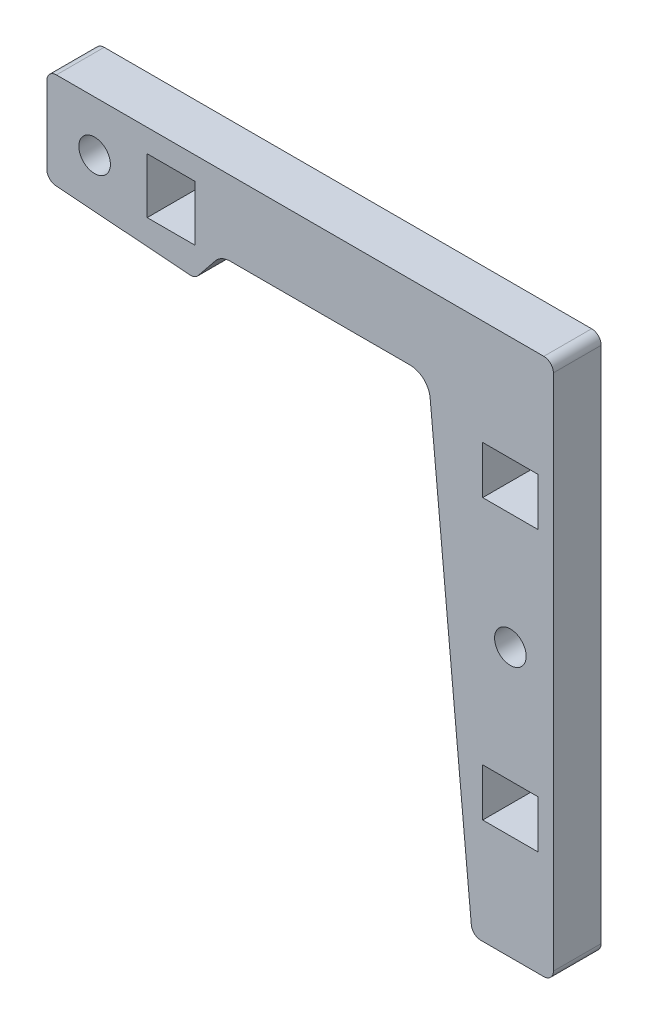
ISO-10303-21;
HEADER;
FILE_DESCRIPTION(('STEP AP214'),'2;1');
FILE_NAME('part.step','',(''),(''),'','','');
FILE_SCHEMA(('AUTOMOTIVE_DESIGN { 1 0 10303 214 1 1 1 1 }'));
ENDSEC;
DATA;
#1=APPLICATION_CONTEXT('core data for automotive mechanical design processes');
#2=APPLICATION_PROTOCOL_DEFINITION('international standard','automotive_design',2000,#1);
#3=PRODUCT_CONTEXT('',#1,'mechanical');
#4=PRODUCT('Part','Part','',(#3));
#5=PRODUCT_RELATED_PRODUCT_CATEGORY('part','',(#4));
#6=PRODUCT_DEFINITION_FORMATION('','',#4);
#7=PRODUCT_DEFINITION_CONTEXT('part definition',#1,'design');
#8=PRODUCT_DEFINITION('design','',#6,#7);
#9=PRODUCT_DEFINITION_SHAPE('','',#8);
#10=(LENGTH_UNIT() NAMED_UNIT(*) SI_UNIT(.MILLI.,.METRE.));
#11=(NAMED_UNIT(*) PLANE_ANGLE_UNIT() SI_UNIT($,.RADIAN.));
#12=(NAMED_UNIT(*) SI_UNIT($,.STERADIAN.) SOLID_ANGLE_UNIT());
#13=UNCERTAINTY_MEASURE_WITH_UNIT(LENGTH_MEASURE(1.E-05),#10,'distance_accuracy_value','');
#14=(GEOMETRIC_REPRESENTATION_CONTEXT(3) GLOBAL_UNCERTAINTY_ASSIGNED_CONTEXT((#13)) GLOBAL_UNIT_ASSIGNED_CONTEXT((#10,
#11,#12)) REPRESENTATION_CONTEXT('',''));
#15=CARTESIAN_POINT('',(0.,0.,0.));
#16=DIRECTION('',(0.,0.,1.));
#17=DIRECTION('',(1.,0.,0.));
#18=AXIS2_PLACEMENT_3D('',#15,#16,#17);
#19=CARTESIAN_POINT('',(394.462,25.6699999680005,79.314999993));
#20=DIRECTION('',(0.,0.,-1.));
#21=DIRECTION('',(-1.,0.,0.));
#22=AXIS2_PLACEMENT_3D('',#19,#20,#21);
#23=PLANE('',#22);
#24=DIRECTION('',(0.,1.,0.));
#25=VECTOR('',#24,1.);
#26=CARTESIAN_POINT('',(435.360750815999,24.13,79.314999993));
#27=LINE('',#26,#25);
#28=CARTESIAN_POINT('',(435.360750815999,17.78,79.314999993));
#29=VERTEX_POINT('',#28);
#30=CARTESIAN_POINT('',(435.360750815999,24.13,79.314999993));
#31=VERTEX_POINT('',#30);
#32=EDGE_CURVE('E264',#29,#31,#27,.T.);
#33=ORIENTED_EDGE('',*,*,#32,.F.);
#34=DIRECTION('',(1.,0.,0.));
#35=VECTOR('',#34,1.);
#36=CARTESIAN_POINT('',(428.010750783999,17.78,79.314999993));
#37=LINE('',#36,#35);
#38=CARTESIAN_POINT('',(428.010750783999,17.78,79.314999993));
#39=VERTEX_POINT('',#38);
#40=EDGE_CURVE('E272',#39,#29,#37,.T.);
#41=ORIENTED_EDGE('',*,*,#40,.F.);
#42=DIRECTION('',(0.,-1.,0.));
#43=VECTOR('',#42,1.);
#44=CARTESIAN_POINT('',(428.010750783999,24.13,79.314999993));
#45=LINE('',#44,#43);
#46=CARTESIAN_POINT('',(428.010750783999,24.13,79.314999993));
#47=VERTEX_POINT('',#46);
#48=EDGE_CURVE('E269',#47,#39,#45,.T.);
#49=ORIENTED_EDGE('',*,*,#48,.F.);
#50=DIRECTION('',(-1.,0.,0.));
#51=VECTOR('',#50,1.);
#52=CARTESIAN_POINT('',(428.010750783999,24.13,79.314999993));
#53=LINE('',#52,#51);
#54=EDGE_CURVE('E266',#31,#47,#53,.T.);
#55=ORIENTED_EDGE('',*,*,#54,.F.);
#56=EDGE_LOOP('',(#33,#41,#49,#55));
#57=FACE_BOUND('',#56,.T.);
#58=CARTESIAN_POINT('',(376.440750799999,31.3849999680003,79.314999993));
#59=DIRECTION('',(0.,0.,1.));
#60=DIRECTION('',(1.,0.,0.));
#61=AXIS2_PLACEMENT_3D('',#58,#59,#60);
#62=CIRCLE('',#61,2.09999999100001);
#63=CARTESIAN_POINT('',(378.540750791,31.3849999680003,79.314999993));
#64=VERTEX_POINT('',#63);
#65=EDGE_CURVE('E332',#64,#64,#62,.T.);
#66=ORIENTED_EDGE('',*,*,#65,.F.);
#67=EDGE_LOOP('',(#66));
#68=FACE_BOUND('',#67,.T.);
#69=DIRECTION('',(1.,0.,0.));
#70=VECTOR('',#69,1.);
#71=CARTESIAN_POINT('',(426.605750799999,-33.2899999679999,79.314999993));
#72=LINE('',#71,#70);
#73=CARTESIAN_POINT('',(427.7613488368,-33.2899999679999,79.314999993));
#74=VERTEX_POINT('',#73);
#75=CARTESIAN_POINT('',(436.130750799999,-33.2899999679999,79.314999993));
#76=VERTEX_POINT('',#75);
#77=EDGE_CURVE('E357',#74,#76,#72,.T.);
#78=ORIENTED_EDGE('',*,*,#77,.T.);
#79=CARTESIAN_POINT('',(436.130750799999,-32.0199999679999,79.314999993));
#80=DIRECTION('',(0.,0.,-1.));
#81=DIRECTION('',(-1.,0.,0.));
#82=AXIS2_PLACEMENT_3D('',#79,#80,#81);
#83=CIRCLE('',#82,1.27);
#84=CARTESIAN_POINT('',(437.400750799999,-32.0199999679999,79.314999993));
#85=VERTEX_POINT('',#84);
#86=EDGE_CURVE('E429',#76,#85,#83,.F.);
#87=ORIENTED_EDGE('',*,*,#86,.T.);
#88=DIRECTION('',(0.,1.,0.));
#89=VECTOR('',#88,1.);
#90=CARTESIAN_POINT('',(437.400750799999,-33.2899999679999,79.314999993));
#91=LINE('',#90,#89);
#92=CARTESIAN_POINT('',(437.400750799999,36.83,79.314999993));
#93=VERTEX_POINT('',#92);
#94=EDGE_CURVE('E360',#85,#93,#91,.T.);
#95=ORIENTED_EDGE('',*,*,#94,.T.);
#96=CARTESIAN_POINT('',(436.130750799999,36.83,79.314999993));
#97=DIRECTION('',(0.,0.,-1.));
#98=DIRECTION('',(-1.,0.,0.));
#99=AXIS2_PLACEMENT_3D('',#96,#97,#98);
#100=CIRCLE('',#99,1.27);
#101=CARTESIAN_POINT('',(436.130750799999,38.1,79.314999993));
#102=VERTEX_POINT('',#101);
#103=EDGE_CURVE('E427',#93,#102,#100,.F.);
#104=ORIENTED_EDGE('',*,*,#103,.T.);
#105=DIRECTION('',(-1.,0.,0.));
#106=VECTOR('',#105,1.);
#107=CARTESIAN_POINT('',(437.400750799999,38.1,79.314999993));
#108=LINE('',#107,#106);
#109=CARTESIAN_POINT('',(371.3607508,38.1,79.314999993));
#110=VERTEX_POINT('',#109);
#111=EDGE_CURVE('E338',#102,#110,#108,.T.);
#112=ORIENTED_EDGE('',*,*,#111,.T.);
#113=CARTESIAN_POINT('',(371.3607508,36.83,79.314999993));
#114=DIRECTION('',(0.,0.,-1.));
#115=DIRECTION('',(-1.,0.,0.));
#116=AXIS2_PLACEMENT_3D('',#113,#114,#115);
#117=CIRCLE('',#116,1.27);
#118=CARTESIAN_POINT('',(370.0907508,36.83,79.314999993));
#119=VERTEX_POINT('',#118);
#120=EDGE_CURVE('E425',#110,#119,#117,.F.);
#121=ORIENTED_EDGE('',*,*,#120,.T.);
#122=DIRECTION('',(0.,-1.,0.));
#123=VECTOR('',#122,1.);
#124=CARTESIAN_POINT('',(370.0907508,38.1,79.314999993));
#125=LINE('',#124,#123);
#126=CARTESIAN_POINT('',(370.0907508,26.5769075709626,79.314999993));
#127=VERTEX_POINT('',#126);
#128=EDGE_CURVE('E341',#119,#127,#125,.T.);
#129=ORIENTED_EDGE('',*,*,#128,.T.);
#130=CARTESIAN_POINT('',(371.3607508,26.5769075709626,79.314999993));
#131=DIRECTION('',(0.,0.,-1.));
#132=DIRECTION('',(-1.,0.,0.));
#133=AXIS2_PLACEMENT_3D('',#130,#131,#132);
#134=CIRCLE('',#133,1.27);
#135=CARTESIAN_POINT('',(371.264256343641,25.3105786958705,79.314999993));
#136=VERTEX_POINT('',#135);
#137=EDGE_CURVE('E421',#127,#136,#134,.F.);
#138=ORIENTED_EDGE('',*,*,#137,.T.);
#139=DIRECTION('',(0.997109350466224,-0.0759798868966356,0.));
#140=VECTOR('',#139,1.);
#141=CARTESIAN_POINT('',(370.0907508,25.4,79.314999993));
#142=LINE('',#141,#140);
#143=CARTESIAN_POINT('',(389.109268652957,23.9507859948022,79.314999993));
#144=VERTEX_POINT('',#143);
#145=EDGE_CURVE('E345',#136,#144,#142,.T.);
#146=ORIENTED_EDGE('',*,*,#145,.T.);
#147=CARTESIAN_POINT('',(389.205763109316,25.2171148698943,79.314999993));
#148=DIRECTION('',(0.,0.,-1.));
#149=DIRECTION('',(-1.,0.,0.));
#150=AXIS2_PLACEMENT_3D('',#147,#148,#149);
#151=CIRCLE('',#150,1.27);
#152=CARTESIAN_POINT('',(390.194953697403,24.4206213166004,79.314999993));
#153=VERTEX_POINT('',#152);
#154=EDGE_CURVE('E57',#144,#153,#151,.F.);
#155=ORIENTED_EDGE('',*,*,#154,.T.);
#156=DIRECTION('',(0.627160278184164,0.778890226840703,0.));
#157=VECTOR('',#156,1.);
#158=CARTESIAN_POINT('',(389.775750799999,23.8999999520003,79.314999993));
#159=LINE('',#158,#157);
#160=CARTESIAN_POINT('',(392.483618823825,27.2629870745882,79.314999993));
#161=VERTEX_POINT('',#160);
#162=EDGE_CURVE('E347',#153,#161,#159,.T.);
#163=ORIENTED_EDGE('',*,*,#162,.T.);
#164=CARTESIAN_POINT('',(394.462,25.6699999680005,79.314999993));
#165=DIRECTION('',(0.,0.,-1.));
#166=DIRECTION('',(-1.,0.,0.));
#167=AXIS2_PLACEMENT_3D('',#164,#165,#166);
#168=CIRCLE('',#167,2.54000000000002);
#169=CARTESIAN_POINT('',(394.462,28.2099999680005,79.314999993));
#170=VERTEX_POINT('',#169);
#171=EDGE_CURVE('E349',#161,#170,#168,.T.);
#172=ORIENTED_EDGE('',*,*,#171,.T.);
#173=DIRECTION('',(1.,0.,0.));
#174=VECTOR('',#173,1.);
#175=CARTESIAN_POINT('',(394.462,28.2099999680004,79.314999993));
#176=LINE('',#175,#174);
#177=CARTESIAN_POINT('',(418.338,28.2099999680005,79.314999993));
#178=VERTEX_POINT('',#177);
#179=EDGE_CURVE('E351',#170,#178,#176,.T.);
#180=ORIENTED_EDGE('',*,*,#179,.T.);
#181=CARTESIAN_POINT('',(418.338,25.5135074700115,79.314999993));
#182=DIRECTION('',(0.,0.,-1.));
#183=DIRECTION('',(1.,0.,0.));
#184=AXIS2_PLACEMENT_3D('',#181,#182,#183);
#185=CIRCLE('',#184,2.69649249798897);
#186=CARTESIAN_POINT('',(421.022522516097,25.7673000078818,79.314999993));
#187=VERTEX_POINT('',#186);
#188=EDGE_CURVE('E353',#178,#187,#185,.T.);
#189=ORIENTED_EDGE('',*,*,#188,.T.);
#190=DIRECTION('',(0.0941195045265449,-0.995560906658994,0.));
#191=VECTOR('',#190,1.);
#192=CARTESIAN_POINT('',(421.022522516097,25.7673000078818,79.314999993));
#193=LINE('',#192,#191);
#194=CARTESIAN_POINT('',(426.496986485343,-32.1395317387486,79.314999993));
#195=VERTEX_POINT('',#194);
#196=EDGE_CURVE('E355',#187,#195,#193,.T.);
#197=ORIENTED_EDGE('',*,*,#196,.T.);
#198=CARTESIAN_POINT('',(427.7613488368,-32.0199999679999,79.314999993));
#199=DIRECTION('',(0.,0.,-1.));
#200=DIRECTION('',(-1.,0.,0.));
#201=AXIS2_PLACEMENT_3D('',#198,#199,#200);
#202=CIRCLE('',#201,1.27);
#203=EDGE_CURVE('E423',#195,#74,#202,.F.);
#204=ORIENTED_EDGE('',*,*,#203,.T.);
#205=EDGE_LOOP('',(#78,#87,#95,#104,#112,#121,#129,#138,#146,#155,#163,#172,#180,#189,#197,#204));
#206=FACE_BOUND('',#205,.T.);
#207=DIRECTION('',(0.,1.,0.));
#208=VECTOR('',#207,1.);
#209=CARTESIAN_POINT('',(389.7757508,35.0599999840003,79.314999993));
#210=LINE('',#209,#208);
#211=CARTESIAN_POINT('',(389.775750799999,27.7099999520003,79.314999993));
#212=VERTEX_POINT('',#211);
#213=CARTESIAN_POINT('',(389.7757508,35.0599999840003,79.314999993));
#214=VERTEX_POINT('',#213);
#215=EDGE_CURVE('E301',#212,#214,#210,.T.);
#216=ORIENTED_EDGE('',*,*,#215,.F.);
#217=DIRECTION('',(1.,0.,0.));
#218=VECTOR('',#217,1.);
#219=CARTESIAN_POINT('',(383.425750799999,27.7099999520003,79.314999993));
#220=LINE('',#219,#218);
#221=CARTESIAN_POINT('',(383.425750799999,27.7099999520003,79.314999993));
#222=VERTEX_POINT('',#221);
#223=EDGE_CURVE('E309',#222,#212,#220,.T.);
#224=ORIENTED_EDGE('',*,*,#223,.F.);
#225=DIRECTION('',(0.,-1.,0.));
#226=VECTOR('',#225,1.);
#227=CARTESIAN_POINT('',(383.425750799999,35.0599999840003,79.314999993));
#228=LINE('',#227,#226);
#229=CARTESIAN_POINT('',(383.425750799999,35.0599999840003,79.314999993));
#230=VERTEX_POINT('',#229);
#231=EDGE_CURVE('E306',#230,#222,#228,.T.);
#232=ORIENTED_EDGE('',*,*,#231,.F.);
#233=DIRECTION('',(-1.,0.,0.));
#234=VECTOR('',#233,1.);
#235=CARTESIAN_POINT('',(383.425750799999,35.0599999840003,79.314999993));
#236=LINE('',#235,#234);
#237=EDGE_CURVE('E303',#214,#230,#236,.T.);
#238=ORIENTED_EDGE('',*,*,#237,.F.);
#239=EDGE_LOOP('',(#216,#224,#232,#238));
#240=FACE_BOUND('',#239,.T.);
#241=CARTESIAN_POINT('',(431.685750799999,2.40500001600008,79.314999993));
#242=DIRECTION('',(0.,0.,1.));
#243=DIRECTION('',(1.,0.,0.));
#244=AXIS2_PLACEMENT_3D('',#241,#242,#243);
#245=CIRCLE('',#244,2.09999999100001);
#246=CARTESIAN_POINT('',(433.785750790999,2.40500001600008,79.314999993));
#247=VERTEX_POINT('',#246);
#248=EDGE_CURVE('E295',#247,#247,#245,.T.);
#249=ORIENTED_EDGE('',*,*,#248,.F.);
#250=EDGE_LOOP('',(#249));
#251=FACE_BOUND('',#250,.T.);
#252=DIRECTION('',(0.,1.,0.));
#253=VECTOR('',#252,1.);
#254=CARTESIAN_POINT('',(435.360750815999,-12.9699999679999,79.314999993));
#255=LINE('',#254,#253);
#256=CARTESIAN_POINT('',(435.360750815999,-19.3199999679999,79.314999993));
#257=VERTEX_POINT('',#256);
#258=CARTESIAN_POINT('',(435.360750815999,-12.9699999679999,79.314999993));
#259=VERTEX_POINT('',#258);
#260=EDGE_CURVE('E223',#257,#259,#255,.T.);
#261=ORIENTED_EDGE('',*,*,#260,.F.);
#262=DIRECTION('',(1.,0.,0.));
#263=VECTOR('',#262,1.);
#264=CARTESIAN_POINT('',(428.010750783999,-19.3199999679999,79.314999993));
#265=LINE('',#264,#263);
#266=CARTESIAN_POINT('',(428.010750783999,-19.3199999679999,79.314999993));
#267=VERTEX_POINT('',#266);
#268=EDGE_CURVE('E248',#267,#257,#265,.T.);
#269=ORIENTED_EDGE('',*,*,#268,.F.);
#270=DIRECTION('',(0.,-1.,0.));
#271=VECTOR('',#270,1.);
#272=CARTESIAN_POINT('',(428.010750783999,-12.9699999679999,79.314999993));
#273=LINE('',#272,#271);
#274=CARTESIAN_POINT('',(428.010750783999,-12.9699999679999,79.314999993));
#275=VERTEX_POINT('',#274);
#276=EDGE_CURVE('E246',#275,#267,#273,.T.);
#277=ORIENTED_EDGE('',*,*,#276,.F.);
#278=DIRECTION('',(-1.,0.,0.));
#279=VECTOR('',#278,1.);
#280=CARTESIAN_POINT('',(428.010750783999,-12.9699999679999,79.314999993));
#281=LINE('',#280,#279);
#282=EDGE_CURVE('E233',#259,#275,#281,.T.);
#283=ORIENTED_EDGE('',*,*,#282,.F.);
#284=EDGE_LOOP('',(#261,#269,#277,#283));
#285=FACE_BOUND('',#284,.T.);
#286=ADVANCED_FACE('F34',(#57,#68,#206,#240,#251,#285),#23,.F.);
#287=CARTESIAN_POINT('',(394.462,25.6699999680005,72.964999993));
#288=DIRECTION('',(0.,0.,-1.));
#289=DIRECTION('',(-1.,0.,0.));
#290=AXIS2_PLACEMENT_3D('',#287,#288,#289);
#291=PLANE('',#290);
#292=DIRECTION('',(1.,0.,0.));
#293=VECTOR('',#292,1.);
#294=CARTESIAN_POINT('',(383.425750799999,27.7099999520003,72.964999993));
#295=LINE('',#294,#293);
#296=CARTESIAN_POINT('',(383.425750799999,27.7099999520003,72.964999993));
#297=VERTEX_POINT('',#296);
#298=CARTESIAN_POINT('',(389.775750799999,27.7099999520003,72.964999993));
#299=VERTEX_POINT('',#298);
#300=EDGE_CURVE('E304',#297,#299,#295,.T.);
#301=ORIENTED_EDGE('',*,*,#300,.T.);
#302=DIRECTION('',(0.,1.,0.));
#303=VECTOR('',#302,1.);
#304=CARTESIAN_POINT('',(389.7757508,35.0599999840003,72.964999993));
#305=LINE('',#304,#303);
#306=CARTESIAN_POINT('',(389.7757508,35.0599999840003,72.964999993));
#307=VERTEX_POINT('',#306);
#308=EDGE_CURVE('E298',#299,#307,#305,.T.);
#309=ORIENTED_EDGE('',*,*,#308,.T.);
#310=DIRECTION('',(-1.,0.,0.));
#311=VECTOR('',#310,1.);
#312=CARTESIAN_POINT('',(383.425750799999,35.0599999840003,72.964999993));
#313=LINE('',#312,#311);
#314=CARTESIAN_POINT('',(383.425750799999,35.0599999840003,72.964999993));
#315=VERTEX_POINT('',#314);
#316=EDGE_CURVE('E314',#307,#315,#313,.T.);
#317=ORIENTED_EDGE('',*,*,#316,.T.);
#318=DIRECTION('',(0.,-1.,0.));
#319=VECTOR('',#318,1.);
#320=CARTESIAN_POINT('',(383.425750799999,35.0599999840003,72.964999993));
#321=LINE('',#320,#319);
#322=EDGE_CURVE('E317',#315,#297,#321,.T.);
#323=ORIENTED_EDGE('',*,*,#322,.T.);
#324=EDGE_LOOP('',(#301,#309,#317,#323));
#325=FACE_BOUND('',#324,.T.);
#326=CARTESIAN_POINT('',(376.440750799999,31.3849999680003,72.964999993));
#327=DIRECTION('',(0.,0.,1.));
#328=DIRECTION('',(1.,0.,0.));
#329=AXIS2_PLACEMENT_3D('',#326,#327,#328);
#330=CIRCLE('',#329,2.09999999100001);
#331=CARTESIAN_POINT('',(378.540750791,31.3849999680003,72.964999993));
#332=VERTEX_POINT('',#331);
#333=EDGE_CURVE('E331',#332,#332,#330,.T.);
#334=ORIENTED_EDGE('',*,*,#333,.T.);
#335=EDGE_LOOP('',(#334));
#336=FACE_BOUND('',#335,.T.);
#337=DIRECTION('',(0.,1.,0.));
#338=VECTOR('',#337,1.);
#339=CARTESIAN_POINT('',(437.400750799999,-33.2899999679999,72.964999993));
#340=LINE('',#339,#338);
#341=CARTESIAN_POINT('',(437.400750799999,-32.0199999679999,72.964999993));
#342=VERTEX_POINT('',#341);
#343=CARTESIAN_POINT('',(437.400750799999,36.83,72.964999993));
#344=VERTEX_POINT('',#343);
#345=EDGE_CURVE('E342',#342,#344,#340,.T.);
#346=ORIENTED_EDGE('',*,*,#345,.F.);
#347=CARTESIAN_POINT('',(436.130750799999,-32.0199999679999,72.964999993));
#348=DIRECTION('',(0.,0.,-1.));
#349=DIRECTION('',(-1.,0.,0.));
#350=AXIS2_PLACEMENT_3D('',#347,#348,#349);
#351=CIRCLE('',#350,1.27);
#352=CARTESIAN_POINT('',(436.130750799999,-33.2899999679999,72.964999993));
#353=VERTEX_POINT('',#352);
#354=EDGE_CURVE('E413',#342,#353,#351,.T.);
#355=ORIENTED_EDGE('',*,*,#354,.T.);
#356=DIRECTION('',(1.,0.,0.));
#357=VECTOR('',#356,1.);
#358=CARTESIAN_POINT('',(426.605750799999,-33.2899999679999,72.964999993));
#359=LINE('',#358,#357);
#360=CARTESIAN_POINT('',(427.7613488368,-33.2899999679999,72.964999993));
#361=VERTEX_POINT('',#360);
#362=EDGE_CURVE('E382',#361,#353,#359,.T.);
#363=ORIENTED_EDGE('',*,*,#362,.F.);
#364=CARTESIAN_POINT('',(427.7613488368,-32.0199999679999,72.964999993));
#365=DIRECTION('',(0.,0.,-1.));
#366=DIRECTION('',(-1.,0.,0.));
#367=AXIS2_PLACEMENT_3D('',#364,#365,#366);
#368=CIRCLE('',#367,1.27);
#369=CARTESIAN_POINT('',(426.496986485343,-32.1395317387486,72.964999993));
#370=VERTEX_POINT('',#369);
#371=EDGE_CURVE('E407',#361,#370,#368,.T.);
#372=ORIENTED_EDGE('',*,*,#371,.T.);
#373=DIRECTION('',(0.0941195045265449,-0.995560906658994,0.));
#374=VECTOR('',#373,1.);
#375=CARTESIAN_POINT('',(421.022522516097,25.7673000078818,72.964999993));
#376=LINE('',#375,#374);
#377=CARTESIAN_POINT('',(421.022522516097,25.7673000078818,72.964999993));
#378=VERTEX_POINT('',#377);
#379=EDGE_CURVE('E380',#378,#370,#376,.T.);
#380=ORIENTED_EDGE('',*,*,#379,.F.);
#381=CARTESIAN_POINT('',(418.338,25.5135074700115,72.964999993));
#382=DIRECTION('',(0.,0.,-1.));
#383=DIRECTION('',(1.,0.,0.));
#384=AXIS2_PLACEMENT_3D('',#381,#382,#383);
#385=CIRCLE('',#384,2.69649249798897);
#386=CARTESIAN_POINT('',(418.338,28.2099999680005,72.964999993));
#387=VERTEX_POINT('',#386);
#388=EDGE_CURVE('E378',#387,#378,#385,.T.);
#389=ORIENTED_EDGE('',*,*,#388,.F.);
#390=DIRECTION('',(1.,0.,0.));
#391=VECTOR('',#390,1.);
#392=CARTESIAN_POINT('',(394.462,28.2099999680004,72.964999993));
#393=LINE('',#392,#391);
#394=CARTESIAN_POINT('',(394.462,28.2099999680005,72.964999993));
#395=VERTEX_POINT('',#394);
#396=EDGE_CURVE('E376',#395,#387,#393,.T.);
#397=ORIENTED_EDGE('',*,*,#396,.F.);
#398=CARTESIAN_POINT('',(394.462,25.6699999680005,72.964999993));
#399=DIRECTION('',(0.,0.,-1.));
#400=DIRECTION('',(-1.,0.,0.));
#401=AXIS2_PLACEMENT_3D('',#398,#399,#400);
#402=CIRCLE('',#401,2.54000000000002);
#403=CARTESIAN_POINT('',(392.483618823825,27.2629870745882,72.964999993));
#404=VERTEX_POINT('',#403);
#405=EDGE_CURVE('E374',#404,#395,#402,.T.);
#406=ORIENTED_EDGE('',*,*,#405,.F.);
#407=DIRECTION('',(0.627160278184164,0.778890226840703,0.));
#408=VECTOR('',#407,1.);
#409=CARTESIAN_POINT('',(389.775750799999,23.8999999520003,72.964999993));
#410=LINE('',#409,#408);
#411=CARTESIAN_POINT('',(390.194953697403,24.4206213166004,72.964999993));
#412=VERTEX_POINT('',#411);
#413=EDGE_CURVE('E372',#412,#404,#410,.T.);
#414=ORIENTED_EDGE('',*,*,#413,.F.);
#415=CARTESIAN_POINT('',(389.205763109316,25.2171148698943,72.964999993));
#416=DIRECTION('',(0.,0.,-1.));
#417=DIRECTION('',(-1.,0.,0.));
#418=AXIS2_PLACEMENT_3D('',#415,#416,#417);
#419=CIRCLE('',#418,1.27);
#420=CARTESIAN_POINT('',(389.109268652957,23.9507859948022,72.964999993));
#421=VERTEX_POINT('',#420);
#422=EDGE_CURVE('E403',#412,#421,#419,.T.);
#423=ORIENTED_EDGE('',*,*,#422,.T.);
#424=DIRECTION('',(0.997109350466224,-0.0759798868966356,0.));
#425=VECTOR('',#424,1.);
#426=CARTESIAN_POINT('',(370.0907508,25.4,72.964999993));
#427=LINE('',#426,#425);
#428=CARTESIAN_POINT('',(371.264256343641,25.3105786958705,72.964999993));
#429=VERTEX_POINT('',#428);
#430=EDGE_CURVE('E369',#429,#421,#427,.T.);
#431=ORIENTED_EDGE('',*,*,#430,.F.);
#432=CARTESIAN_POINT('',(371.3607508,26.5769075709626,72.964999993));
#433=DIRECTION('',(0.,0.,-1.));
#434=DIRECTION('',(-1.,0.,0.));
#435=AXIS2_PLACEMENT_3D('',#432,#433,#434);
#436=CIRCLE('',#435,1.27);
#437=CARTESIAN_POINT('',(370.0907508,26.5769075709626,72.964999993));
#438=VERTEX_POINT('',#437);
#439=EDGE_CURVE('E405',#429,#438,#436,.T.);
#440=ORIENTED_EDGE('',*,*,#439,.T.);
#441=DIRECTION('',(0.,-1.,0.));
#442=VECTOR('',#441,1.);
#443=CARTESIAN_POINT('',(370.0907508,38.1,72.964999993));
#444=LINE('',#443,#442);
#445=CARTESIAN_POINT('',(370.0907508,36.83,72.964999993));
#446=VERTEX_POINT('',#445);
#447=EDGE_CURVE('E366',#446,#438,#444,.T.);
#448=ORIENTED_EDGE('',*,*,#447,.F.);
#449=CARTESIAN_POINT('',(371.3607508,36.83,72.964999993));
#450=DIRECTION('',(0.,0.,-1.));
#451=DIRECTION('',(-1.,0.,0.));
#452=AXIS2_PLACEMENT_3D('',#449,#450,#451);
#453=CIRCLE('',#452,1.27);
#454=CARTESIAN_POINT('',(371.3607508,38.1,72.964999993));
#455=VERTEX_POINT('',#454);
#456=EDGE_CURVE('E409',#446,#455,#453,.T.);
#457=ORIENTED_EDGE('',*,*,#456,.T.);
#458=DIRECTION('',(-1.,0.,0.));
#459=VECTOR('',#458,1.);
#460=CARTESIAN_POINT('',(437.400750799999,38.1,72.964999993));
#461=LINE('',#460,#459);
#462=CARTESIAN_POINT('',(436.130750799999,38.1,72.964999993));
#463=VERTEX_POINT('',#462);
#464=EDGE_CURVE('E335',#463,#455,#461,.T.);
#465=ORIENTED_EDGE('',*,*,#464,.F.);
#466=CARTESIAN_POINT('',(436.130750799999,36.83,72.964999993));
#467=DIRECTION('',(0.,0.,-1.));
#468=DIRECTION('',(-1.,0.,0.));
#469=AXIS2_PLACEMENT_3D('',#466,#467,#468);
#470=CIRCLE('',#469,1.27);
#471=EDGE_CURVE('E411',#463,#344,#470,.T.);
#472=ORIENTED_EDGE('',*,*,#471,.T.);
#473=EDGE_LOOP('',(#346,#355,#363,#372,#380,#389,#397,#406,#414,#423,#431,#440,#448,#457,#465,#472));
#474=FACE_BOUND('',#473,.T.);
#475=CARTESIAN_POINT('',(431.685750799999,2.40500001600008,72.964999993));
#476=DIRECTION('',(0.,0.,1.));
#477=DIRECTION('',(1.,0.,0.));
#478=AXIS2_PLACEMENT_3D('',#475,#476,#477);
#479=CIRCLE('',#478,2.09999999100001);
#480=CARTESIAN_POINT('',(433.785750790999,2.40500001600008,72.964999993));
#481=VERTEX_POINT('',#480);
#482=EDGE_CURVE('E294',#481,#481,#479,.T.);
#483=ORIENTED_EDGE('',*,*,#482,.T.);
#484=EDGE_LOOP('',(#483));
#485=FACE_BOUND('',#484,.T.);
#486=DIRECTION('',(1.,0.,0.));
#487=VECTOR('',#486,1.);
#488=CARTESIAN_POINT('',(428.010750783999,17.78,72.964999993));
#489=LINE('',#488,#487);
#490=CARTESIAN_POINT('',(428.010750783999,17.78,72.964999993));
#491=VERTEX_POINT('',#490);
#492=CARTESIAN_POINT('',(435.360750815999,17.78,72.964999993));
#493=VERTEX_POINT('',#492);
#494=EDGE_CURVE('E267',#491,#493,#489,.T.);
#495=ORIENTED_EDGE('',*,*,#494,.T.);
#496=DIRECTION('',(0.,1.,0.));
#497=VECTOR('',#496,1.);
#498=CARTESIAN_POINT('',(435.360750815999,24.13,72.964999993));
#499=LINE('',#498,#497);
#500=CARTESIAN_POINT('',(435.360750815999,24.13,72.964999993));
#501=VERTEX_POINT('',#500);
#502=EDGE_CURVE('E241',#493,#501,#499,.T.);
#503=ORIENTED_EDGE('',*,*,#502,.T.);
#504=DIRECTION('',(-1.,0.,0.));
#505=VECTOR('',#504,1.);
#506=CARTESIAN_POINT('',(428.010750783999,24.13,72.964999993));
#507=LINE('',#506,#505);
#508=CARTESIAN_POINT('',(428.010750783999,24.13,72.964999993));
#509=VERTEX_POINT('',#508);
#510=EDGE_CURVE('E277',#501,#509,#507,.T.);
#511=ORIENTED_EDGE('',*,*,#510,.T.);
#512=DIRECTION('',(0.,-1.,0.));
#513=VECTOR('',#512,1.);
#514=CARTESIAN_POINT('',(428.010750783999,24.13,72.964999993));
#515=LINE('',#514,#513);
#516=EDGE_CURVE('E280',#509,#491,#515,.T.);
#517=ORIENTED_EDGE('',*,*,#516,.T.);
#518=EDGE_LOOP('',(#495,#503,#511,#517));
#519=FACE_BOUND('',#518,.T.);
#520=DIRECTION('',(1.,0.,0.));
#521=VECTOR('',#520,1.);
#522=CARTESIAN_POINT('',(428.010750783999,-19.3199999679999,72.964999993));
#523=LINE('',#522,#521);
#524=CARTESIAN_POINT('',(428.010750783999,-19.3199999679999,72.964999993));
#525=VERTEX_POINT('',#524);
#526=CARTESIAN_POINT('',(435.360750815999,-19.3199999679999,72.964999993));
#527=VERTEX_POINT('',#526);
#528=EDGE_CURVE('E234',#525,#527,#523,.T.);
#529=ORIENTED_EDGE('',*,*,#528,.T.);
#530=DIRECTION('',(0.,1.,0.));
#531=VECTOR('',#530,1.);
#532=CARTESIAN_POINT('',(435.360750815999,-12.9699999679999,72.964999993));
#533=LINE('',#532,#531);
#534=CARTESIAN_POINT('',(435.360750815999,-12.9699999679999,72.964999993));
#535=VERTEX_POINT('',#534);
#536=EDGE_CURVE('E252',#527,#535,#533,.T.);
#537=ORIENTED_EDGE('',*,*,#536,.T.);
#538=DIRECTION('',(-1.,0.,0.));
#539=VECTOR('',#538,1.);
#540=CARTESIAN_POINT('',(428.010750783999,-12.9699999679999,72.964999993));
#541=LINE('',#540,#539);
#542=CARTESIAN_POINT('',(428.010750783999,-12.9699999679999,72.964999993));
#543=VERTEX_POINT('',#542);
#544=EDGE_CURVE('E240',#535,#543,#541,.T.);
#545=ORIENTED_EDGE('',*,*,#544,.T.);
#546=DIRECTION('',(0.,-1.,0.));
#547=VECTOR('',#546,1.);
#548=CARTESIAN_POINT('',(428.010750783999,-12.9699999679999,72.964999993));
#549=LINE('',#548,#547);
#550=EDGE_CURVE('E255',#543,#525,#549,.T.);
#551=ORIENTED_EDGE('',*,*,#550,.T.);
#552=EDGE_LOOP('',(#529,#537,#545,#551));
#553=FACE_BOUND('',#552,.T.);
#554=ADVANCED_FACE('F454',(#325,#336,#474,#485,#519,#553),#291,.T.);
#555=CARTESIAN_POINT('',(437.400750799999,38.1,79.314999993));
#556=DIRECTION('',(0.,-1.,0.));
#557=DIRECTION('',(0.,0.,-1.));
#558=AXIS2_PLACEMENT_3D('',#555,#556,#557);
#559=PLANE('',#558);
#560=ORIENTED_EDGE('',*,*,#111,.F.);
#561=DIRECTION('',(0.,0.,-1.));
#562=VECTOR('',#561,1.);
#563=CARTESIAN_POINT('',(436.130750799999,38.1,79.314999993));
#564=LINE('',#563,#562);
#565=EDGE_CURVE('E433',#102,#463,#564,.T.);
#566=ORIENTED_EDGE('',*,*,#565,.T.);
#567=ORIENTED_EDGE('',*,*,#464,.T.);
#568=DIRECTION('',(0.,0.,-1.));
#569=VECTOR('',#568,1.);
#570=CARTESIAN_POINT('',(371.3607508,38.1,79.314999993));
#571=LINE('',#570,#569);
#572=EDGE_CURVE('E431',#455,#110,#571,.F.);
#573=ORIENTED_EDGE('',*,*,#572,.T.);
#574=EDGE_LOOP('',(#560,#566,#567,#573));
#575=FACE_BOUND('',#574,.T.);
#576=ADVANCED_FACE('F504',(#575),#559,.F.);
#577=CARTESIAN_POINT('',(370.0907508,38.1,79.314999993));
#578=DIRECTION('',(1.,0.,0.));
#579=DIRECTION('',(0.,0.,-1.));
#580=AXIS2_PLACEMENT_3D('',#577,#578,#579);
#581=PLANE('',#580);
#582=ORIENTED_EDGE('',*,*,#128,.F.);
#583=DIRECTION('',(0.,0.,-1.));
#584=VECTOR('',#583,1.);
#585=CARTESIAN_POINT('',(370.0907508,36.83,79.314999993));
#586=LINE('',#585,#584);
#587=EDGE_CURVE('E438',#119,#446,#586,.T.);
#588=ORIENTED_EDGE('',*,*,#587,.T.);
#589=ORIENTED_EDGE('',*,*,#447,.T.);
#590=DIRECTION('',(0.,0.,-1.));
#591=VECTOR('',#590,1.);
#592=CARTESIAN_POINT('',(370.0907508,26.5769075709626,79.314999993));
#593=LINE('',#592,#591);
#594=EDGE_CURVE('E436',#438,#127,#593,.F.);
#595=ORIENTED_EDGE('',*,*,#594,.T.);
#596=EDGE_LOOP('',(#582,#588,#589,#595));
#597=FACE_BOUND('',#596,.T.);
#598=ADVANCED_FACE('F512',(#597),#581,.F.);
#599=CARTESIAN_POINT('',(370.0907508,25.4,79.314999993));
#600=DIRECTION('',(0.0759798868966356,0.997109350466224,0.));
#601=DIRECTION('',(-0.997109350466224,0.0759798868966356,0.));
#602=AXIS2_PLACEMENT_3D('',#599,#600,#601);
#603=PLANE('',#602);
#604=ORIENTED_EDGE('',*,*,#145,.F.);
#605=DIRECTION('',(0.,0.,-1.));
#606=VECTOR('',#605,1.);
#607=CARTESIAN_POINT('',(371.264256343641,25.3105786958705,79.314999993));
#608=LINE('',#607,#606);
#609=EDGE_CURVE('E42',#136,#429,#608,.T.);
#610=ORIENTED_EDGE('',*,*,#609,.T.);
#611=ORIENTED_EDGE('',*,*,#430,.T.);
#612=DIRECTION('',(0.,0.,-1.));
#613=VECTOR('',#612,1.);
#614=CARTESIAN_POINT('',(389.109268652957,23.9507859948022,79.314999993));
#615=LINE('',#614,#613);
#616=EDGE_CURVE('E442',#421,#144,#615,.F.);
#617=ORIENTED_EDGE('',*,*,#616,.T.);
#618=EDGE_LOOP('',(#604,#610,#611,#617));
#619=FACE_BOUND('',#618,.T.);
#620=ADVANCED_FACE('F448',(#619),#603,.F.);
#621=CARTESIAN_POINT('',(389.775750799999,23.8999999520003,79.314999993));
#622=DIRECTION('',(-0.778890226840703,0.627160278184164,0.));
#623=DIRECTION('',(-0.627160278184164,-0.778890226840704,0.));
#624=AXIS2_PLACEMENT_3D('',#621,#622,#623);
#625=PLANE('',#624);
#626=ORIENTED_EDGE('',*,*,#162,.F.);
#627=DIRECTION('',(0.,0.,-1.));
#628=VECTOR('',#627,1.);
#629=CARTESIAN_POINT('',(390.194953697403,24.4206213166004,79.314999993));
#630=LINE('',#629,#628);
#631=EDGE_CURVE('E11',#153,#412,#630,.T.);
#632=ORIENTED_EDGE('',*,*,#631,.T.);
#633=ORIENTED_EDGE('',*,*,#413,.T.);
#634=DIRECTION('',(0.,0.,-1.));
#635=VECTOR('',#634,1.);
#636=CARTESIAN_POINT('',(392.483618823825,27.2629870745882,79.314999993));
#637=LINE('',#636,#635);
#638=EDGE_CURVE('E395',#161,#404,#637,.T.);
#639=ORIENTED_EDGE('',*,*,#638,.F.);
#640=EDGE_LOOP('',(#626,#632,#633,#639));
#641=FACE_BOUND('',#640,.T.);
#642=ADVANCED_FACE('F462',(#641),#625,.F.);
#643=CARTESIAN_POINT('',(394.462,25.6699999680005,79.314999993));
#644=DIRECTION('',(0.,0.,-1.));
#645=DIRECTION('',(-1.,0.,0.));
#646=AXIS2_PLACEMENT_3D('',#643,#644,#645);
#647=CYLINDRICAL_SURFACE('',#646,2.54000000000002);
#648=ORIENTED_EDGE('',*,*,#405,.T.);
#649=DIRECTION('',(0.,0.,-1.));
#650=VECTOR('',#649,1.);
#651=CARTESIAN_POINT('',(394.462,28.2099999680005,79.314999993));
#652=LINE('',#651,#650);
#653=EDGE_CURVE('E392',#170,#395,#652,.T.);
#654=ORIENTED_EDGE('',*,*,#653,.F.);
#655=ORIENTED_EDGE('',*,*,#171,.F.);
#656=ORIENTED_EDGE('',*,*,#638,.T.);
#657=EDGE_LOOP('',(#648,#654,#655,#656));
#658=FACE_BOUND('',#657,.T.);
#659=ADVANCED_FACE('F470',(#658),#647,.F.);
#660=CARTESIAN_POINT('',(394.462,28.2099999680004,79.314999993));
#661=DIRECTION('',(0.,1.,0.));
#662=DIRECTION('',(-1.,0.,0.));
#663=AXIS2_PLACEMENT_3D('',#660,#661,#662);
#664=PLANE('',#663);
#665=ORIENTED_EDGE('',*,*,#396,.T.);
#666=DIRECTION('',(0.,0.,-1.));
#667=VECTOR('',#666,1.);
#668=CARTESIAN_POINT('',(418.338,28.2099999680005,79.314999993));
#669=LINE('',#668,#667);
#670=EDGE_CURVE('E389',#178,#387,#669,.T.);
#671=ORIENTED_EDGE('',*,*,#670,.F.);
#672=ORIENTED_EDGE('',*,*,#179,.F.);
#673=ORIENTED_EDGE('',*,*,#653,.T.);
#674=EDGE_LOOP('',(#665,#671,#672,#673));
#675=FACE_BOUND('',#674,.T.);
#676=ADVANCED_FACE('F473',(#675),#664,.F.);
#677=CARTESIAN_POINT('',(418.338,25.5135074700115,79.314999993));
#678=DIRECTION('',(0.,0.,-1.));
#679=DIRECTION('',(-1.,0.,0.));
#680=AXIS2_PLACEMENT_3D('',#677,#678,#679);
#681=CYLINDRICAL_SURFACE('',#680,2.69649249798897);
#682=ORIENTED_EDGE('',*,*,#388,.T.);
#683=DIRECTION('',(0.,0.,-1.));
#684=VECTOR('',#683,1.);
#685=CARTESIAN_POINT('',(421.022522516097,25.7673000078818,79.314999993));
#686=LINE('',#685,#684);
#687=EDGE_CURVE('E363',#187,#378,#686,.T.);
#688=ORIENTED_EDGE('',*,*,#687,.F.);
#689=ORIENTED_EDGE('',*,*,#188,.F.);
#690=ORIENTED_EDGE('',*,*,#670,.T.);
#691=EDGE_LOOP('',(#682,#688,#689,#690));
#692=FACE_BOUND('',#691,.T.);
#693=ADVANCED_FACE('F478',(#692),#681,.F.);
#694=CARTESIAN_POINT('',(421.022522516097,25.7673000078818,79.314999993));
#695=DIRECTION('',(0.995560906658994,0.0941195045265449,0.));
#696=DIRECTION('',(-0.0941195045265449,0.995560906658994,0.));
#697=AXIS2_PLACEMENT_3D('',#694,#695,#696);
#698=PLANE('',#697);
#699=ORIENTED_EDGE('',*,*,#379,.T.);
#700=DIRECTION('',(0.,0.,-1.));
#701=VECTOR('',#700,1.);
#702=CARTESIAN_POINT('',(426.496986485343,-32.1395317387486,79.314999993));
#703=LINE('',#702,#701);
#704=EDGE_CURVE('E49',#370,#195,#703,.F.);
#705=ORIENTED_EDGE('',*,*,#704,.T.);
#706=ORIENTED_EDGE('',*,*,#196,.F.);
#707=ORIENTED_EDGE('',*,*,#687,.T.);
#708=EDGE_LOOP('',(#699,#705,#706,#707));
#709=FACE_BOUND('',#708,.T.);
#710=ADVANCED_FACE('F539',(#709),#698,.F.);
#711=CARTESIAN_POINT('',(426.605750799999,-33.2899999679999,79.314999993));
#712=DIRECTION('',(0.,1.,0.));
#713=DIRECTION('',(0.,0.,1.));
#714=AXIS2_PLACEMENT_3D('',#711,#712,#713);
#715=PLANE('',#714);
#716=ORIENTED_EDGE('',*,*,#362,.T.);
#717=DIRECTION('',(0.,0.,-1.));
#718=VECTOR('',#717,1.);
#719=CARTESIAN_POINT('',(436.130750799999,-33.2899999679999,79.314999993));
#720=LINE('',#719,#718);
#721=EDGE_CURVE('E418',#353,#76,#720,.F.);
#722=ORIENTED_EDGE('',*,*,#721,.T.);
#723=ORIENTED_EDGE('',*,*,#77,.F.);
#724=DIRECTION('',(0.,0.,-1.));
#725=VECTOR('',#724,1.);
#726=CARTESIAN_POINT('',(427.7613488368,-33.2899999679999,79.314999993));
#727=LINE('',#726,#725);
#728=EDGE_CURVE('E415',#74,#361,#727,.T.);
#729=ORIENTED_EDGE('',*,*,#728,.T.);
#730=EDGE_LOOP('',(#716,#722,#723,#729));
#731=FACE_BOUND('',#730,.T.);
#732=ADVANCED_FACE('F486',(#731),#715,.F.);
#733=CARTESIAN_POINT('',(437.400750799999,-33.2899999679999,79.314999993));
#734=DIRECTION('',(-1.,0.,0.));
#735=DIRECTION('',(0.,0.,1.));
#736=AXIS2_PLACEMENT_3D('',#733,#734,#735);
#737=PLANE('',#736);
#738=ORIENTED_EDGE('',*,*,#94,.F.);
#739=DIRECTION('',(0.,0.,-1.));
#740=VECTOR('',#739,1.);
#741=CARTESIAN_POINT('',(437.400750799999,-32.0199999679999,79.314999993));
#742=LINE('',#741,#740);
#743=EDGE_CURVE('E400',#85,#342,#742,.T.);
#744=ORIENTED_EDGE('',*,*,#743,.T.);
#745=ORIENTED_EDGE('',*,*,#345,.T.);
#746=DIRECTION('',(0.,0.,-1.));
#747=VECTOR('',#746,1.);
#748=CARTESIAN_POINT('',(437.400750799999,36.83,79.314999993));
#749=LINE('',#748,#747);
#750=EDGE_CURVE('E398',#344,#93,#749,.F.);
#751=ORIENTED_EDGE('',*,*,#750,.T.);
#752=EDGE_LOOP('',(#738,#744,#745,#751));
#753=FACE_BOUND('',#752,.T.);
#754=ADVANCED_FACE('F495',(#753),#737,.F.);
#755=CARTESIAN_POINT('',(376.440750799999,31.3849999680003,79.314999993));
#756=DIRECTION('',(0.,0.,-1.));
#757=DIRECTION('',(-1.,0.,0.));
#758=AXIS2_PLACEMENT_3D('',#755,#756,#757);
#759=CYLINDRICAL_SURFACE('',#758,2.09999999100001);
#760=ORIENTED_EDGE('',*,*,#65,.T.);
#761=EDGE_LOOP('',(#760));
#762=FACE_BOUND('',#761,.T.);
#763=ORIENTED_EDGE('',*,*,#333,.F.);
#764=EDGE_LOOP('',(#763));
#765=FACE_BOUND('',#764,.T.);
#766=ADVANCED_FACE('F532',(#762,#765),#759,.F.);
#767=CARTESIAN_POINT('',(389.7757508,35.0599999840003,79.314999993));
#768=DIRECTION('',(-1.,0.,0.));
#769=DIRECTION('',(0.,-1.,0.));
#770=AXIS2_PLACEMENT_3D('',#767,#768,#769);
#771=PLANE('',#770);
#772=ORIENTED_EDGE('',*,*,#308,.F.);
#773=DIRECTION('',(0.,0.,-1.));
#774=VECTOR('',#773,1.);
#775=CARTESIAN_POINT('',(389.775750799999,27.7099999520003,79.314999993));
#776=LINE('',#775,#774);
#777=EDGE_CURVE('E311',#212,#299,#776,.T.);
#778=ORIENTED_EDGE('',*,*,#777,.F.);
#779=ORIENTED_EDGE('',*,*,#215,.T.);
#780=DIRECTION('',(0.,0.,-1.));
#781=VECTOR('',#780,1.);
#782=CARTESIAN_POINT('',(389.7757508,35.0599999840003,79.314999993));
#783=LINE('',#782,#781);
#784=EDGE_CURVE('E328',#214,#307,#783,.T.);
#785=ORIENTED_EDGE('',*,*,#784,.T.);
#786=EDGE_LOOP('',(#772,#778,#779,#785));
#787=FACE_BOUND('',#786,.T.);
#788=ADVANCED_FACE('F755',(#787),#771,.T.);
#789=CARTESIAN_POINT('',(383.425750799999,35.0599999840003,79.314999993));
#790=DIRECTION('',(0.,-1.,0.));
#791=DIRECTION('',(0.,0.,-1.));
#792=AXIS2_PLACEMENT_3D('',#789,#790,#791);
#793=PLANE('',#792);
#794=ORIENTED_EDGE('',*,*,#316,.F.);
#795=ORIENTED_EDGE('',*,*,#784,.F.);
#796=ORIENTED_EDGE('',*,*,#237,.T.);
#797=DIRECTION('',(0.,0.,-1.));
#798=VECTOR('',#797,1.);
#799=CARTESIAN_POINT('',(383.425750799999,35.0599999840003,79.314999993));
#800=LINE('',#799,#798);
#801=EDGE_CURVE('E326',#230,#315,#800,.T.);
#802=ORIENTED_EDGE('',*,*,#801,.T.);
#803=EDGE_LOOP('',(#794,#795,#796,#802));
#804=FACE_BOUND('',#803,.T.);
#805=ADVANCED_FACE('F746',(#804),#793,.T.);
#806=CARTESIAN_POINT('',(383.425750799999,35.0599999840003,79.314999993));
#807=DIRECTION('',(1.,0.,0.));
#808=DIRECTION('',(0.,0.,-1.));
#809=AXIS2_PLACEMENT_3D('',#806,#807,#808);
#810=PLANE('',#809);
#811=ORIENTED_EDGE('',*,*,#322,.F.);
#812=ORIENTED_EDGE('',*,*,#801,.F.);
#813=ORIENTED_EDGE('',*,*,#231,.T.);
#814=DIRECTION('',(0.,0.,-1.));
#815=VECTOR('',#814,1.);
#816=CARTESIAN_POINT('',(383.425750799999,27.7099999520003,79.314999993));
#817=LINE('',#816,#815);
#818=EDGE_CURVE('E324',#222,#297,#817,.T.);
#819=ORIENTED_EDGE('',*,*,#818,.T.);
#820=EDGE_LOOP('',(#811,#812,#813,#819));
#821=FACE_BOUND('',#820,.T.);
#822=ADVANCED_FACE('F737',(#821),#810,.T.);
#823=CARTESIAN_POINT('',(383.425750799999,27.7099999520003,79.314999993));
#824=DIRECTION('',(0.,1.,0.));
#825=DIRECTION('',(0.,0.,1.));
#826=AXIS2_PLACEMENT_3D('',#823,#824,#825);
#827=PLANE('',#826);
#828=ORIENTED_EDGE('',*,*,#300,.F.);
#829=ORIENTED_EDGE('',*,*,#818,.F.);
#830=ORIENTED_EDGE('',*,*,#223,.T.);
#831=ORIENTED_EDGE('',*,*,#777,.T.);
#832=EDGE_LOOP('',(#828,#829,#830,#831));
#833=FACE_BOUND('',#832,.T.);
#834=ADVANCED_FACE('F728',(#833),#827,.T.);
#835=CARTESIAN_POINT('',(431.685750799999,2.40500001600008,79.314999993));
#836=DIRECTION('',(0.,0.,-1.));
#837=DIRECTION('',(-1.,0.,0.));
#838=AXIS2_PLACEMENT_3D('',#835,#836,#837);
#839=CYLINDRICAL_SURFACE('',#838,2.09999999100001);
#840=ORIENTED_EDGE('',*,*,#248,.T.);
#841=EDGE_LOOP('',(#840));
#842=FACE_BOUND('',#841,.T.);
#843=ORIENTED_EDGE('',*,*,#482,.F.);
#844=EDGE_LOOP('',(#843));
#845=FACE_BOUND('',#844,.T.);
#846=ADVANCED_FACE('F719',(#842,#845),#839,.F.);
#847=CARTESIAN_POINT('',(435.360750815999,24.13,79.314999993));
#848=DIRECTION('',(-1.,0.,0.));
#849=DIRECTION('',(0.,-1.,0.));
#850=AXIS2_PLACEMENT_3D('',#847,#848,#849);
#851=PLANE('',#850);
#852=ORIENTED_EDGE('',*,*,#502,.F.);
#853=DIRECTION('',(0.,0.,-1.));
#854=VECTOR('',#853,1.);
#855=CARTESIAN_POINT('',(435.360750815999,17.78,79.314999993));
#856=LINE('',#855,#854);
#857=EDGE_CURVE('E274',#29,#493,#856,.T.);
#858=ORIENTED_EDGE('',*,*,#857,.F.);
#859=ORIENTED_EDGE('',*,*,#32,.T.);
#860=DIRECTION('',(0.,0.,-1.));
#861=VECTOR('',#860,1.);
#862=CARTESIAN_POINT('',(435.360750815999,24.13,79.314999993));
#863=LINE('',#862,#861);
#864=EDGE_CURVE('E291',#31,#501,#863,.T.);
#865=ORIENTED_EDGE('',*,*,#864,.T.);
#866=EDGE_LOOP('',(#852,#858,#859,#865));
#867=FACE_BOUND('',#866,.T.);
#868=ADVANCED_FACE('F710',(#867),#851,.T.);
#869=CARTESIAN_POINT('',(428.010750783999,24.13,79.314999993));
#870=DIRECTION('',(0.,-1.,0.));
#871=DIRECTION('',(0.,0.,-1.));
#872=AXIS2_PLACEMENT_3D('',#869,#870,#871);
#873=PLANE('',#872);
#874=ORIENTED_EDGE('',*,*,#510,.F.);
#875=ORIENTED_EDGE('',*,*,#864,.F.);
#876=ORIENTED_EDGE('',*,*,#54,.T.);
#877=DIRECTION('',(0.,0.,-1.));
#878=VECTOR('',#877,1.);
#879=CARTESIAN_POINT('',(428.010750783999,24.13,79.314999993));
#880=LINE('',#879,#878);
#881=EDGE_CURVE('E289',#47,#509,#880,.T.);
#882=ORIENTED_EDGE('',*,*,#881,.T.);
#883=EDGE_LOOP('',(#874,#875,#876,#882));
#884=FACE_BOUND('',#883,.T.);
#885=ADVANCED_FACE('F701',(#884),#873,.T.);
#886=CARTESIAN_POINT('',(428.010750783999,24.13,79.314999993));
#887=DIRECTION('',(1.,0.,0.));
#888=DIRECTION('',(0.,0.,-1.));
#889=AXIS2_PLACEMENT_3D('',#886,#887,#888);
#890=PLANE('',#889);
#891=ORIENTED_EDGE('',*,*,#516,.F.);
#892=ORIENTED_EDGE('',*,*,#881,.F.);
#893=ORIENTED_EDGE('',*,*,#48,.T.);
#894=DIRECTION('',(0.,0.,-1.));
#895=VECTOR('',#894,1.);
#896=CARTESIAN_POINT('',(428.010750783999,17.78,79.314999993));
#897=LINE('',#896,#895);
#898=EDGE_CURVE('E287',#39,#491,#897,.T.);
#899=ORIENTED_EDGE('',*,*,#898,.T.);
#900=EDGE_LOOP('',(#891,#892,#893,#899));
#901=FACE_BOUND('',#900,.T.);
#902=ADVANCED_FACE('F692',(#901),#890,.T.);
#903=CARTESIAN_POINT('',(428.010750783999,17.78,79.314999993));
#904=DIRECTION('',(0.,1.,0.));
#905=DIRECTION('',(0.,0.,1.));
#906=AXIS2_PLACEMENT_3D('',#903,#904,#905);
#907=PLANE('',#906);
#908=ORIENTED_EDGE('',*,*,#494,.F.);
#909=ORIENTED_EDGE('',*,*,#898,.F.);
#910=ORIENTED_EDGE('',*,*,#40,.T.);
#911=ORIENTED_EDGE('',*,*,#857,.T.);
#912=EDGE_LOOP('',(#908,#909,#910,#911));
#913=FACE_BOUND('',#912,.T.);
#914=ADVANCED_FACE('F684',(#913),#907,.T.);
#915=CARTESIAN_POINT('',(435.360750815999,-12.9699999679999,79.314999993));
#916=DIRECTION('',(-1.,0.,0.));
#917=DIRECTION('',(0.,-1.,0.));
#918=AXIS2_PLACEMENT_3D('',#915,#916,#917);
#919=PLANE('',#918);
#920=ORIENTED_EDGE('',*,*,#536,.F.);
#921=DIRECTION('',(0.,0.,-1.));
#922=VECTOR('',#921,1.);
#923=CARTESIAN_POINT('',(435.360750815999,-19.3199999679999,79.314999993));
#924=LINE('',#923,#922);
#925=EDGE_CURVE('E229',#257,#527,#924,.T.);
#926=ORIENTED_EDGE('',*,*,#925,.F.);
#927=ORIENTED_EDGE('',*,*,#260,.T.);
#928=DIRECTION('',(0.,0.,-1.));
#929=VECTOR('',#928,1.);
#930=CARTESIAN_POINT('',(435.360750815999,-12.9699999679999,79.314999993));
#931=LINE('',#930,#929);
#932=EDGE_CURVE('E226',#259,#535,#931,.T.);
#933=ORIENTED_EDGE('',*,*,#932,.T.);
#934=EDGE_LOOP('',(#920,#926,#927,#933));
#935=FACE_BOUND('',#934,.T.);
#936=ADVANCED_FACE('F225',(#935),#919,.T.);
#937=CARTESIAN_POINT('',(428.010750783999,-12.9699999679999,79.314999993));
#938=DIRECTION('',(0.,-1.,0.));
#939=DIRECTION('',(0.,0.,-1.));
#940=AXIS2_PLACEMENT_3D('',#937,#938,#939);
#941=PLANE('',#940);
#942=ORIENTED_EDGE('',*,*,#544,.F.);
#943=ORIENTED_EDGE('',*,*,#932,.F.);
#944=ORIENTED_EDGE('',*,*,#282,.T.);
#945=DIRECTION('',(0.,0.,-1.));
#946=VECTOR('',#945,1.);
#947=CARTESIAN_POINT('',(428.010750783999,-12.9699999679999,79.314999993));
#948=LINE('',#947,#946);
#949=EDGE_CURVE('E242',#275,#543,#948,.T.);
#950=ORIENTED_EDGE('',*,*,#949,.T.);
#951=EDGE_LOOP('',(#942,#943,#944,#950));
#952=FACE_BOUND('',#951,.T.);
#953=ADVANCED_FACE('F237',(#952),#941,.T.);
#954=CARTESIAN_POINT('',(428.010750783999,-12.9699999679999,79.314999993));
#955=DIRECTION('',(1.,0.,0.));
#956=DIRECTION('',(0.,0.,-1.));
#957=AXIS2_PLACEMENT_3D('',#954,#955,#956);
#958=PLANE('',#957);
#959=ORIENTED_EDGE('',*,*,#550,.F.);
#960=ORIENTED_EDGE('',*,*,#949,.F.);
#961=ORIENTED_EDGE('',*,*,#276,.T.);
#962=DIRECTION('',(0.,0.,-1.));
#963=VECTOR('',#962,1.);
#964=CARTESIAN_POINT('',(428.010750783999,-19.3199999679999,79.314999993));
#965=LINE('',#964,#963);
#966=EDGE_CURVE('E261',#267,#525,#965,.T.);
#967=ORIENTED_EDGE('',*,*,#966,.T.);
#968=EDGE_LOOP('',(#959,#960,#961,#967));
#969=FACE_BOUND('',#968,.T.);
#970=ADVANCED_FACE('F660',(#969),#958,.T.);
#971=CARTESIAN_POINT('',(428.010750783999,-19.3199999679999,79.314999993));
#972=DIRECTION('',(0.,1.,0.));
#973=DIRECTION('',(0.,0.,1.));
#974=AXIS2_PLACEMENT_3D('',#971,#972,#973);
#975=PLANE('',#974);
#976=ORIENTED_EDGE('',*,*,#528,.F.);
#977=ORIENTED_EDGE('',*,*,#966,.F.);
#978=ORIENTED_EDGE('',*,*,#268,.T.);
#979=ORIENTED_EDGE('',*,*,#925,.T.);
#980=EDGE_LOOP('',(#976,#977,#978,#979));
#981=FACE_BOUND('',#980,.T.);
#982=ADVANCED_FACE('F558',(#981),#975,.T.);
#983=CARTESIAN_POINT('',(436.130750799999,-32.0199999679999,79.314999993));
#984=DIRECTION('',(0.,0.,-1.));
#985=DIRECTION('',(-1.,0.,0.));
#986=AXIS2_PLACEMENT_3D('',#983,#984,#985);
#987=CYLINDRICAL_SURFACE('',#986,1.27);
#988=ORIENTED_EDGE('',*,*,#86,.F.);
#989=ORIENTED_EDGE('',*,*,#721,.F.);
#990=ORIENTED_EDGE('',*,*,#354,.F.);
#991=ORIENTED_EDGE('',*,*,#743,.F.);
#992=EDGE_LOOP('',(#988,#989,#990,#991));
#993=FACE_BOUND('',#992,.T.);
#994=ADVANCED_FACE('F492',(#993),#987,.T.);
#995=CARTESIAN_POINT('',(436.130750799999,36.83,79.314999993));
#996=DIRECTION('',(0.,0.,-1.));
#997=DIRECTION('',(-1.,0.,0.));
#998=AXIS2_PLACEMENT_3D('',#995,#996,#997);
#999=CYLINDRICAL_SURFACE('',#998,1.27);
#1000=ORIENTED_EDGE('',*,*,#103,.F.);
#1001=ORIENTED_EDGE('',*,*,#750,.F.);
#1002=ORIENTED_EDGE('',*,*,#471,.F.);
#1003=ORIENTED_EDGE('',*,*,#565,.F.);
#1004=EDGE_LOOP('',(#1000,#1001,#1002,#1003));
#1005=FACE_BOUND('',#1004,.T.);
#1006=ADVANCED_FACE('F501',(#1005),#999,.T.);
#1007=CARTESIAN_POINT('',(371.3607508,36.83,79.314999993));
#1008=DIRECTION('',(0.,0.,-1.));
#1009=DIRECTION('',(-1.,0.,0.));
#1010=AXIS2_PLACEMENT_3D('',#1007,#1008,#1009);
#1011=CYLINDRICAL_SURFACE('',#1010,1.27);
#1012=ORIENTED_EDGE('',*,*,#120,.F.);
#1013=ORIENTED_EDGE('',*,*,#572,.F.);
#1014=ORIENTED_EDGE('',*,*,#456,.F.);
#1015=ORIENTED_EDGE('',*,*,#587,.F.);
#1016=EDGE_LOOP('',(#1012,#1013,#1014,#1015));
#1017=FACE_BOUND('',#1016,.T.);
#1018=ADVANCED_FACE('F509',(#1017),#1011,.T.);
#1019=CARTESIAN_POINT('',(427.7613488368,-32.0199999679999,79.314999993));
#1020=DIRECTION('',(0.,0.,-1.));
#1021=DIRECTION('',(-1.,0.,0.));
#1022=AXIS2_PLACEMENT_3D('',#1019,#1020,#1021);
#1023=CYLINDRICAL_SURFACE('',#1022,1.27);
#1024=ORIENTED_EDGE('',*,*,#203,.F.);
#1025=ORIENTED_EDGE('',*,*,#704,.F.);
#1026=ORIENTED_EDGE('',*,*,#371,.F.);
#1027=ORIENTED_EDGE('',*,*,#728,.F.);
#1028=EDGE_LOOP('',(#1024,#1025,#1026,#1027));
#1029=FACE_BOUND('',#1028,.T.);
#1030=ADVANCED_FACE('F483',(#1029),#1023,.T.);
#1031=CARTESIAN_POINT('',(371.3607508,26.5769075709626,79.314999993));
#1032=DIRECTION('',(0.,0.,-1.));
#1033=DIRECTION('',(-1.,0.,0.));
#1034=AXIS2_PLACEMENT_3D('',#1031,#1032,#1033);
#1035=CYLINDRICAL_SURFACE('',#1034,1.27);
#1036=ORIENTED_EDGE('',*,*,#137,.F.);
#1037=ORIENTED_EDGE('',*,*,#594,.F.);
#1038=ORIENTED_EDGE('',*,*,#439,.F.);
#1039=ORIENTED_EDGE('',*,*,#609,.F.);
#1040=EDGE_LOOP('',(#1036,#1037,#1038,#1039));
#1041=FACE_BOUND('',#1040,.T.);
#1042=ADVANCED_FACE('F514',(#1041),#1035,.T.);
#1043=CARTESIAN_POINT('',(389.205763109316,25.2171148698943,79.314999993));
#1044=DIRECTION('',(0.,0.,-1.));
#1045=DIRECTION('',(-1.,0.,0.));
#1046=AXIS2_PLACEMENT_3D('',#1043,#1044,#1045);
#1047=CYLINDRICAL_SURFACE('',#1046,1.27);
#1048=ORIENTED_EDGE('',*,*,#154,.F.);
#1049=ORIENTED_EDGE('',*,*,#616,.F.);
#1050=ORIENTED_EDGE('',*,*,#422,.F.);
#1051=ORIENTED_EDGE('',*,*,#631,.F.);
#1052=EDGE_LOOP('',(#1048,#1049,#1050,#1051));
#1053=FACE_BOUND('',#1052,.T.);
#1054=ADVANCED_FACE('F36',(#1053),#1047,.T.);
#1055=CLOSED_SHELL('',(#286,#554,#576,#598,#620,#642,#659,#676,#693,#710,#732,#754,#766,#788,
#805,#822,#834,#846,#868,#885,#902,#914,#936,#953,#970,#982,#994,#1006,#1018,#1030,#1042,#1054));
#1056=MANIFOLD_SOLID_BREP('B2',#1055);
#1057=ADVANCED_BREP_SHAPE_REPRESENTATION('',(#18,#1056),#14);
#1058=SHAPE_DEFINITION_REPRESENTATION(#9,#1057);
ENDSEC;
END-ISO-10303-21;
